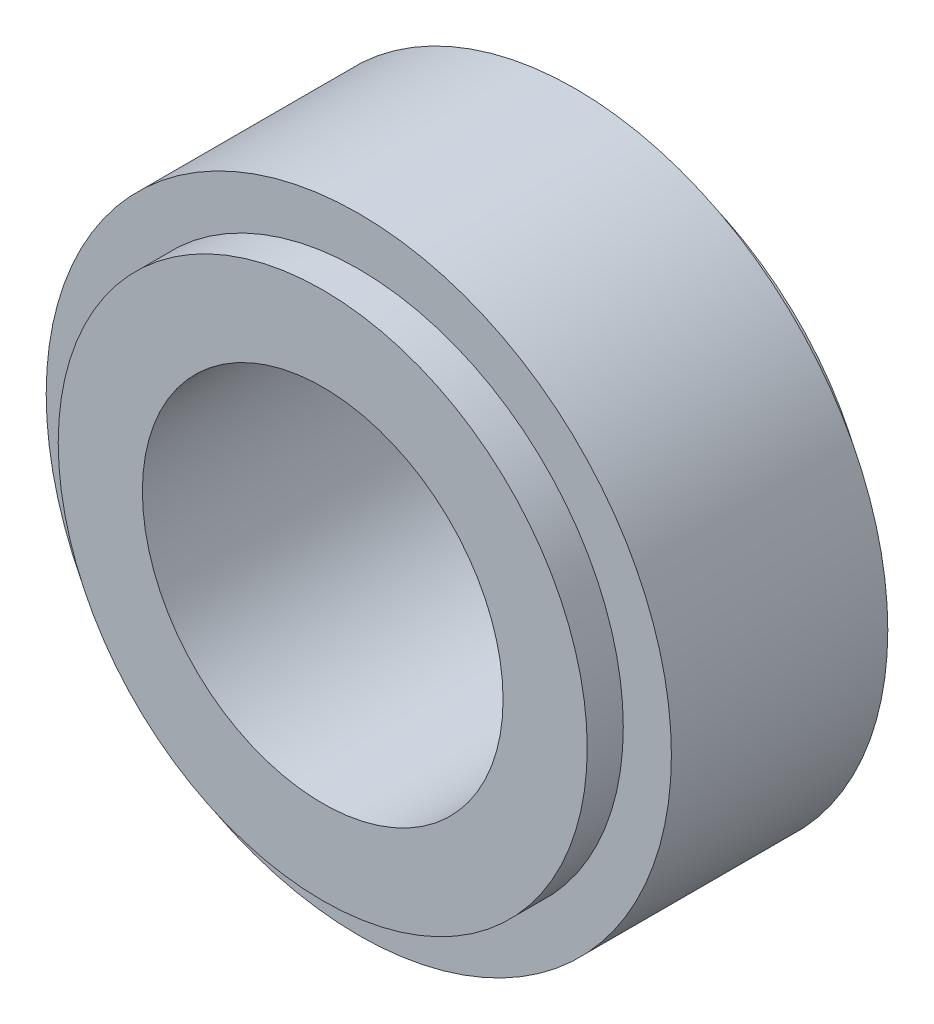
ISO-10303-21;
HEADER;
FILE_DESCRIPTION(('STEP AP214'),'2;1');
FILE_NAME('part.step','',(''),(''),'','','');
FILE_SCHEMA(('AUTOMOTIVE_DESIGN { 1 0 10303 214 1 1 1 1 }'));
ENDSEC;
DATA;
#1=APPLICATION_CONTEXT('core data for automotive mechanical design processes');
#2=APPLICATION_PROTOCOL_DEFINITION('international standard','automotive_design',2000,#1);
#3=PRODUCT_CONTEXT('',#1,'mechanical');
#4=PRODUCT('Part','Part','',(#3));
#5=PRODUCT_RELATED_PRODUCT_CATEGORY('part','',(#4));
#6=PRODUCT_DEFINITION_FORMATION('','',#4);
#7=PRODUCT_DEFINITION_CONTEXT('part definition',#1,'design');
#8=PRODUCT_DEFINITION('design','',#6,#7);
#9=PRODUCT_DEFINITION_SHAPE('','',#8);
#10=(LENGTH_UNIT() NAMED_UNIT(*) SI_UNIT(.MILLI.,.METRE.));
#11=(NAMED_UNIT(*) PLANE_ANGLE_UNIT() SI_UNIT($,.RADIAN.));
#12=(NAMED_UNIT(*) SI_UNIT($,.STERADIAN.) SOLID_ANGLE_UNIT());
#13=UNCERTAINTY_MEASURE_WITH_UNIT(LENGTH_MEASURE(1.E-05),#10,'distance_accuracy_value','');
#14=(GEOMETRIC_REPRESENTATION_CONTEXT(3) GLOBAL_UNCERTAINTY_ASSIGNED_CONTEXT((#13)) GLOBAL_UNIT_ASSIGNED_CONTEXT((#10,
#11,#12)) REPRESENTATION_CONTEXT('',''));
#15=CARTESIAN_POINT('',(0.,0.,0.));
#16=DIRECTION('',(0.,0.,1.));
#17=DIRECTION('',(1.,0.,0.));
#18=AXIS2_PLACEMENT_3D('',#15,#16,#17);
#19=CARTESIAN_POINT('',(0.,0.,6.));
#20=DIRECTION('',(0.,0.,-1.));
#21=DIRECTION('',(-1.,0.,0.));
#22=AXIS2_PLACEMENT_3D('',#19,#20,#21);
#23=CYLINDRICAL_SURFACE('',#22,11.);
#24=CARTESIAN_POINT('',(0.,0.,-6.));
#25=DIRECTION('',(0.,0.,1.));
#26=DIRECTION('',(1.,0.,0.));
#27=AXIS2_PLACEMENT_3D('',#24,#25,#26);
#28=CIRCLE('',#27,11.);
#29=CARTESIAN_POINT('',(11.,0.,-6.));
#30=VERTEX_POINT('',#29);
#31=EDGE_CURVE('E40',#30,#30,#28,.T.);
#32=ORIENTED_EDGE('',*,*,#31,.T.);
#33=EDGE_LOOP('',(#32));
#34=FACE_BOUND('',#33,.T.);
#35=CARTESIAN_POINT('',(0.,0.,-4.5));
#36=DIRECTION('',(0.,0.,1.));
#37=DIRECTION('',(1.,0.,0.));
#38=AXIS2_PLACEMENT_3D('',#35,#36,#37);
#39=CIRCLE('',#38,11.);
#40=CARTESIAN_POINT('',(11.,0.,-4.5));
#41=VERTEX_POINT('',#40);
#42=EDGE_CURVE('E10',#41,#41,#39,.T.);
#43=ORIENTED_EDGE('',*,*,#42,.F.);
#44=EDGE_LOOP('',(#43));
#45=FACE_BOUND('',#44,.T.);
#46=ADVANCED_FACE('F36',(#34,#45),#23,.T.);
#47=CARTESIAN_POINT('',(0.,0.,6.));
#48=DIRECTION('',(0.,0.,1.));
#49=DIRECTION('',(1.,0.,0.));
#50=AXIS2_PLACEMENT_3D('',#47,#48,#49);
#51=PLANE('',#50);
#52=CARTESIAN_POINT('',(0.,0.,6.));
#53=DIRECTION('',(0.,0.,1.));
#54=DIRECTION('',(1.,0.,0.));
#55=AXIS2_PLACEMENT_3D('',#52,#53,#54);
#56=CIRCLE('',#55,11.);
#57=CARTESIAN_POINT('',(11.,0.,6.));
#58=VERTEX_POINT('',#57);
#59=EDGE_CURVE('E44',#58,#58,#56,.T.);
#60=ORIENTED_EDGE('',*,*,#59,.T.);
#61=EDGE_LOOP('',(#60));
#62=FACE_BOUND('',#61,.T.);
#63=CARTESIAN_POINT('',(0.,0.,6.));
#64=DIRECTION('',(0.,0.,1.));
#65=DIRECTION('',(1.,0.,0.));
#66=AXIS2_PLACEMENT_3D('',#63,#64,#65);
#67=CIRCLE('',#66,7.5);
#68=CARTESIAN_POINT('',(7.5,0.,6.));
#69=VERTEX_POINT('',#68);
#70=EDGE_CURVE('E58',#69,#69,#67,.T.);
#71=ORIENTED_EDGE('',*,*,#70,.F.);
#72=EDGE_LOOP('',(#71));
#73=FACE_BOUND('',#72,.T.);
#74=ADVANCED_FACE('F82',(#62,#73),#51,.T.);
#75=CARTESIAN_POINT('',(0.,0.,-6.));
#76=DIRECTION('',(0.,0.,1.));
#77=DIRECTION('',(1.,0.,0.));
#78=AXIS2_PLACEMENT_3D('',#75,#76,#77);
#79=PLANE('',#78);
#80=ORIENTED_EDGE('',*,*,#31,.F.);
#81=EDGE_LOOP('',(#80));
#82=FACE_BOUND('',#81,.T.);
#83=CARTESIAN_POINT('',(0.,0.,-6.));
#84=DIRECTION('',(0.,0.,1.));
#85=DIRECTION('',(1.,0.,0.));
#86=AXIS2_PLACEMENT_3D('',#83,#84,#85);
#87=CIRCLE('',#86,7.5);
#88=CARTESIAN_POINT('',(7.5,0.,-6.));
#89=VERTEX_POINT('',#88);
#90=EDGE_CURVE('E56',#89,#89,#87,.T.);
#91=ORIENTED_EDGE('',*,*,#90,.T.);
#92=EDGE_LOOP('',(#91));
#93=FACE_BOUND('',#92,.T.);
#94=ADVANCED_FACE('F64',(#82,#93),#79,.F.);
#95=CARTESIAN_POINT('',(0.,0.,4.5));
#96=DIRECTION('',(0.,0.,1.));
#97=DIRECTION('',(1.,0.,0.));
#98=AXIS2_PLACEMENT_3D('',#95,#96,#97);
#99=CIRCLE('',#98,11.);
#100=CARTESIAN_POINT('',(11.,0.,4.5));
#101=VERTEX_POINT('',#100);
#102=EDGE_CURVE('E53',#101,#101,#99,.T.);
#103=ORIENTED_EDGE('',*,*,#102,.T.);
#104=EDGE_LOOP('',(#103));
#105=FACE_BOUND('',#104,.T.);
#106=ORIENTED_EDGE('',*,*,#59,.F.);
#107=EDGE_LOOP('',(#106));
#108=FACE_BOUND('',#107,.T.);
#109=ADVANCED_FACE('F38',(#105,#108),#23,.T.);
#110=CARTESIAN_POINT('',(0.,0.,6.));
#111=DIRECTION('',(0.,0.,-1.));
#112=DIRECTION('',(-1.,0.,0.));
#113=AXIS2_PLACEMENT_3D('',#110,#111,#112);
#114=CYLINDRICAL_SURFACE('',#113,7.5);
#115=ORIENTED_EDGE('',*,*,#70,.T.);
#116=EDGE_LOOP('',(#115));
#117=FACE_BOUND('',#116,.T.);
#118=ORIENTED_EDGE('',*,*,#90,.F.);
#119=EDGE_LOOP('',(#118));
#120=FACE_BOUND('',#119,.T.);
#121=ADVANCED_FACE('F66',(#117,#120),#114,.F.);
#122=CARTESIAN_POINT('',(0.,0.,4.5));
#123=DIRECTION('',(0.,0.,1.));
#124=DIRECTION('',(1.,0.,0.));
#125=AXIS2_PLACEMENT_3D('',#122,#123,#124);
#126=PLANE('',#125);
#127=CARTESIAN_POINT('',(0.,0.,4.5));
#128=DIRECTION('',(0.,0.,1.));
#129=DIRECTION('',(1.,0.,0.));
#130=AXIS2_PLACEMENT_3D('',#127,#128,#129);
#131=CIRCLE('',#130,13.);
#132=CARTESIAN_POINT('',(13.,0.,4.5));
#133=VERTEX_POINT('',#132);
#134=EDGE_CURVE('E57',#133,#133,#131,.T.);
#135=ORIENTED_EDGE('',*,*,#134,.T.);
#136=EDGE_LOOP('',(#135));
#137=FACE_BOUND('',#136,.T.);
#138=ORIENTED_EDGE('',*,*,#102,.F.);
#139=EDGE_LOOP('',(#138));
#140=FACE_BOUND('',#139,.T.);
#141=ADVANCED_FACE('F68',(#137,#140),#126,.T.);
#142=CARTESIAN_POINT('',(0.,0.,-4.5));
#143=DIRECTION('',(0.,0.,1.));
#144=DIRECTION('',(1.,0.,0.));
#145=AXIS2_PLACEMENT_3D('',#142,#143,#144);
#146=PLANE('',#145);
#147=CARTESIAN_POINT('',(0.,0.,-4.5));
#148=DIRECTION('',(0.,0.,1.));
#149=DIRECTION('',(1.,0.,0.));
#150=AXIS2_PLACEMENT_3D('',#147,#148,#149);
#151=CIRCLE('',#150,13.);
#152=CARTESIAN_POINT('',(13.,0.,-4.5));
#153=VERTEX_POINT('',#152);
#154=EDGE_CURVE('E51',#153,#153,#151,.T.);
#155=ORIENTED_EDGE('',*,*,#154,.F.);
#156=EDGE_LOOP('',(#155));
#157=FACE_BOUND('',#156,.T.);
#158=ORIENTED_EDGE('',*,*,#42,.T.);
#159=EDGE_LOOP('',(#158));
#160=FACE_BOUND('',#159,.T.);
#161=ADVANCED_FACE('F75',(#157,#160),#146,.F.);
#162=CARTESIAN_POINT('',(0.,0.,4.5));
#163=DIRECTION('',(0.,0.,-1.));
#164=DIRECTION('',(-1.,0.,0.));
#165=AXIS2_PLACEMENT_3D('',#162,#163,#164);
#166=CYLINDRICAL_SURFACE('',#165,13.);
#167=ORIENTED_EDGE('',*,*,#134,.F.);
#168=EDGE_LOOP('',(#167));
#169=FACE_BOUND('',#168,.T.);
#170=ORIENTED_EDGE('',*,*,#154,.T.);
#171=EDGE_LOOP('',(#170));
#172=FACE_BOUND('',#171,.T.);
#173=ADVANCED_FACE('F126',(#169,#172),#166,.T.);
#174=CLOSED_SHELL('',(#46,#74,#94,#109,#121,#141,#161,#173));
#175=MANIFOLD_SOLID_BREP('B2',#174);
#176=ADVANCED_BREP_SHAPE_REPRESENTATION('',(#18,#175),#14);
#177=SHAPE_DEFINITION_REPRESENTATION(#9,#176);
ENDSEC;
END-ISO-10303-21;
